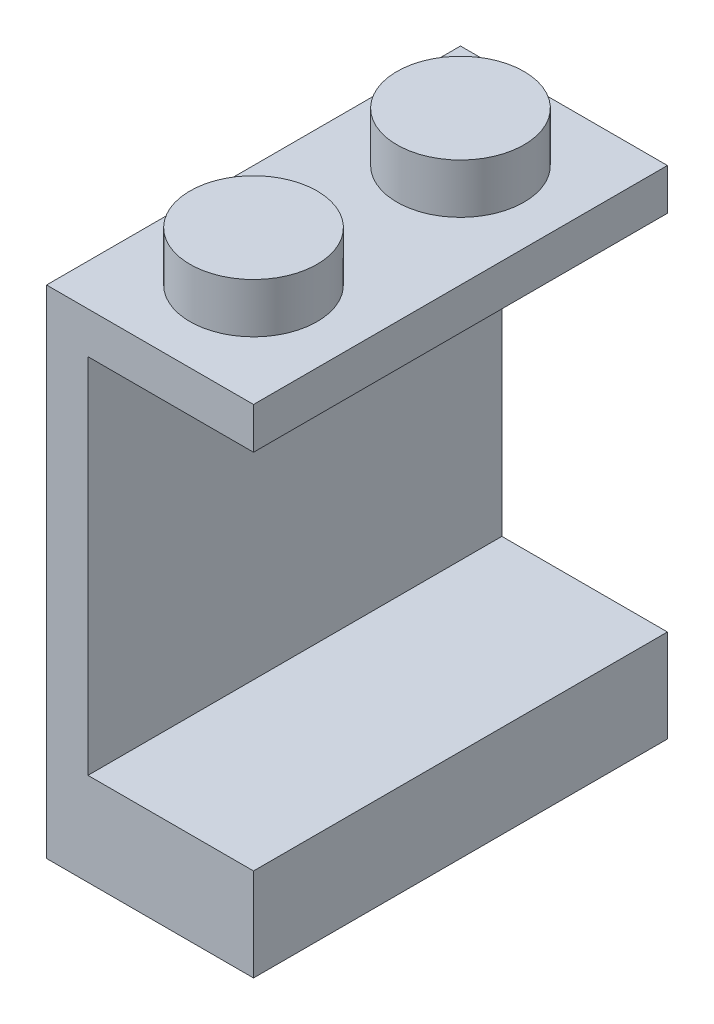
ISO-10303-21;
HEADER;
FILE_DESCRIPTION(('STEP AP214'),'2;1');
FILE_NAME('part.step','',(''),(''),'','','');
FILE_SCHEMA(('AUTOMOTIVE_DESIGN { 1 0 10303 214 1 1 1 1 }'));
ENDSEC;
DATA;
#1=APPLICATION_CONTEXT('core data for automotive mechanical design processes');
#2=APPLICATION_PROTOCOL_DEFINITION('international standard','automotive_design',2000,#1);
#3=PRODUCT_CONTEXT('',#1,'mechanical');
#4=PRODUCT('Part','Part','',(#3));
#5=PRODUCT_RELATED_PRODUCT_CATEGORY('part','',(#4));
#6=PRODUCT_DEFINITION_FORMATION('','',#4);
#7=PRODUCT_DEFINITION_CONTEXT('part definition',#1,'design');
#8=PRODUCT_DEFINITION('design','',#6,#7);
#9=PRODUCT_DEFINITION_SHAPE('','',#8);
#10=(LENGTH_UNIT() NAMED_UNIT(*) SI_UNIT(.MILLI.,.METRE.));
#11=(NAMED_UNIT(*) PLANE_ANGLE_UNIT() SI_UNIT($,.RADIAN.));
#12=(NAMED_UNIT(*) SI_UNIT($,.STERADIAN.) SOLID_ANGLE_UNIT());
#13=UNCERTAINTY_MEASURE_WITH_UNIT(LENGTH_MEASURE(1.E-05),#10,'distance_accuracy_value','');
#14=(GEOMETRIC_REPRESENTATION_CONTEXT(3) GLOBAL_UNCERTAINTY_ASSIGNED_CONTEXT((#13)) GLOBAL_UNIT_ASSIGNED_CONTEXT((#10,
#11,#12)) REPRESENTATION_CONTEXT('',''));
#15=CARTESIAN_POINT('',(0.,0.,0.));
#16=DIRECTION('',(0.,0.,1.));
#17=DIRECTION('',(1.,0.,0.));
#18=AXIS2_PLACEMENT_3D('',#15,#16,#17);
#19=CARTESIAN_POINT('',(3.96875,19.05,7.9375));
#20=DIRECTION('',(-1.,0.,0.));
#21=DIRECTION('',(0.,0.,1.));
#22=AXIS2_PLACEMENT_3D('',#19,#20,#21);
#23=PLANE('',#22);
#24=DIRECTION('',(0.,-1.,0.));
#25=VECTOR('',#24,1.);
#26=CARTESIAN_POINT('',(3.96875,19.05,-7.9375));
#27=LINE('',#26,#25);
#28=CARTESIAN_POINT('',(3.96875,3.556,-7.9375));
#29=VERTEX_POINT('',#28);
#30=CARTESIAN_POINT('',(3.96875,0.,-7.9375));
#31=VERTEX_POINT('',#30);
#32=EDGE_CURVE('E148',#29,#31,#27,.T.);
#33=ORIENTED_EDGE('',*,*,#32,.F.);
#34=DIRECTION('',(0.,0.,1.));
#35=VECTOR('',#34,1.);
#36=CARTESIAN_POINT('',(3.96875,3.556,-7.9375));
#37=LINE('',#36,#35);
#38=CARTESIAN_POINT('',(3.96875,3.556,7.93749999999999));
#39=VERTEX_POINT('',#38);
#40=EDGE_CURVE('E134',#29,#39,#37,.T.);
#41=ORIENTED_EDGE('',*,*,#40,.T.);
#42=DIRECTION('',(0.,-1.,0.));
#43=VECTOR('',#42,1.);
#44=CARTESIAN_POINT('',(3.96875,19.05,7.9375));
#45=LINE('',#44,#43);
#46=CARTESIAN_POINT('',(3.96875,0.,7.9375));
#47=VERTEX_POINT('',#46);
#48=EDGE_CURVE('E146',#39,#47,#45,.T.);
#49=ORIENTED_EDGE('',*,*,#48,.T.);
#50=DIRECTION('',(0.,0.,-1.));
#51=VECTOR('',#50,1.);
#52=CARTESIAN_POINT('',(3.96875,0.,7.9375));
#53=LINE('',#52,#51);
#54=EDGE_CURVE('E508',#47,#31,#53,.T.);
#55=ORIENTED_EDGE('',*,*,#54,.T.);
#56=EDGE_LOOP('',(#33,#41,#49,#55));
#57=FACE_BOUND('',#56,.T.);
#58=ADVANCED_FACE('F42',(#57),#23,.F.);
#59=CARTESIAN_POINT('',(-3.96875,19.05,7.9375));
#60=DIRECTION('',(0.,-1.,0.));
#61=DIRECTION('',(0.,0.,-1.));
#62=AXIS2_PLACEMENT_3D('',#59,#60,#61);
#63=PLANE('',#62);
#64=CARTESIAN_POINT('',(0.,19.05,3.96875));
#65=DIRECTION('',(0.,-1.,0.));
#66=DIRECTION('',(0.,0.,-1.));
#67=AXIS2_PLACEMENT_3D('',#64,#65,#66);
#68=CIRCLE('',#67,2.4384);
#69=CARTESIAN_POINT('',(0.,19.05,1.53035));
#70=VERTEX_POINT('',#69);
#71=EDGE_CURVE('E165',#70,#70,#68,.F.);
#72=ORIENTED_EDGE('',*,*,#71,.F.);
#73=EDGE_LOOP('',(#72));
#74=FACE_BOUND('',#73,.T.);
#75=DIRECTION('',(0.,0.,1.));
#76=VECTOR('',#75,1.);
#77=CARTESIAN_POINT('',(-3.96875,19.05,-7.9375));
#78=LINE('',#77,#76);
#79=CARTESIAN_POINT('',(-3.96875,19.05,-7.9375));
#80=VERTEX_POINT('',#79);
#81=CARTESIAN_POINT('',(-3.96875,19.05,7.9375));
#82=VERTEX_POINT('',#81);
#83=EDGE_CURVE('E513',#80,#82,#78,.T.);
#84=ORIENTED_EDGE('',*,*,#83,.T.);
#85=DIRECTION('',(-1.,0.,0.));
#86=VECTOR('',#85,1.);
#87=CARTESIAN_POINT('',(3.96875,19.05,7.9375));
#88=LINE('',#87,#86);
#89=CARTESIAN_POINT('',(3.96875,19.05,7.9375));
#90=VERTEX_POINT('',#89);
#91=EDGE_CURVE('E515',#90,#82,#88,.T.);
#92=ORIENTED_EDGE('',*,*,#91,.F.);
#93=DIRECTION('',(0.,0.,-1.));
#94=VECTOR('',#93,1.);
#95=CARTESIAN_POINT('',(3.96875,19.05,7.9375));
#96=LINE('',#95,#94);
#97=CARTESIAN_POINT('',(3.96875,19.05,-7.9375));
#98=VERTEX_POINT('',#97);
#99=EDGE_CURVE('E518',#90,#98,#96,.T.);
#100=ORIENTED_EDGE('',*,*,#99,.T.);
#101=DIRECTION('',(1.,0.,0.));
#102=VECTOR('',#101,1.);
#103=CARTESIAN_POINT('',(-3.96875,19.05,-7.9375));
#104=LINE('',#103,#102);
#105=EDGE_CURVE('E520',#80,#98,#104,.T.);
#106=ORIENTED_EDGE('',*,*,#105,.F.);
#107=EDGE_LOOP('',(#84,#92,#100,#106));
#108=FACE_BOUND('',#107,.T.);
#109=CARTESIAN_POINT('',(0.,19.05,-3.96875));
#110=DIRECTION('',(0.,-1.,0.));
#111=DIRECTION('',(0.,0.,-1.));
#112=AXIS2_PLACEMENT_3D('',#109,#110,#111);
#113=CIRCLE('',#112,2.4384);
#114=CARTESIAN_POINT('',(0.,19.05,-6.40715));
#115=VERTEX_POINT('',#114);
#116=EDGE_CURVE('E50',#115,#115,#113,.F.);
#117=ORIENTED_EDGE('',*,*,#116,.F.);
#118=EDGE_LOOP('',(#117));
#119=FACE_BOUND('',#118,.T.);
#120=ADVANCED_FACE('F172',(#74,#108,#119),#63,.F.);
#121=CARTESIAN_POINT('',(-3.96875,19.05,-7.9375));
#122=DIRECTION('',(1.,0.,0.));
#123=DIRECTION('',(0.,0.,-1.));
#124=AXIS2_PLACEMENT_3D('',#121,#122,#123);
#125=PLANE('',#124);
#126=DIRECTION('',(0.,0.,1.));
#127=VECTOR('',#126,1.);
#128=CARTESIAN_POINT('',(-3.96875,0.,-7.9375));
#129=LINE('',#128,#127);
#130=CARTESIAN_POINT('',(-3.96875,0.,-7.9375));
#131=VERTEX_POINT('',#130);
#132=CARTESIAN_POINT('',(-3.96875,0.,7.9375));
#133=VERTEX_POINT('',#132);
#134=EDGE_CURVE('E504',#131,#133,#129,.T.);
#135=ORIENTED_EDGE('',*,*,#134,.T.);
#136=DIRECTION('',(0.,-1.,0.));
#137=VECTOR('',#136,1.);
#138=CARTESIAN_POINT('',(-3.96875,19.05,7.9375));
#139=LINE('',#138,#137);
#140=EDGE_CURVE('E159',#82,#133,#139,.T.);
#141=ORIENTED_EDGE('',*,*,#140,.F.);
#142=ORIENTED_EDGE('',*,*,#83,.F.);
#143=DIRECTION('',(0.,-1.,0.));
#144=VECTOR('',#143,1.);
#145=CARTESIAN_POINT('',(-3.96875,19.05,-7.9375));
#146=LINE('',#145,#144);
#147=EDGE_CURVE('E522',#80,#131,#146,.T.);
#148=ORIENTED_EDGE('',*,*,#147,.T.);
#149=EDGE_LOOP('',(#135,#141,#142,#148));
#150=FACE_BOUND('',#149,.T.);
#151=ADVANCED_FACE('F44',(#150),#125,.F.);
#152=CARTESIAN_POINT('',(3.96875,19.05,7.9375));
#153=DIRECTION('',(0.,0.,1.));
#154=DIRECTION('',(1.,0.,0.));
#155=AXIS2_PLACEMENT_3D('',#152,#153,#154);
#156=PLANE('',#155);
#157=DIRECTION('',(1.,0.,0.));
#158=VECTOR('',#157,1.);
#159=CARTESIAN_POINT('',(-2.38125,3.556,7.93749999999999));
#160=LINE('',#159,#158);
#161=CARTESIAN_POINT('',(-2.38125,3.556,7.93749999999999));
#162=VERTEX_POINT('',#161);
#163=EDGE_CURVE('E130',#162,#39,#160,.T.);
#164=ORIENTED_EDGE('',*,*,#163,.F.);
#165=DIRECTION('',(0.,1.,0.));
#166=VECTOR('',#165,1.);
#167=CARTESIAN_POINT('',(-2.38125,3.556,7.93749999999999));
#168=LINE('',#167,#166);
#169=CARTESIAN_POINT('',(-2.38125,17.4625,7.93749999999999));
#170=VERTEX_POINT('',#169);
#171=EDGE_CURVE('E141',#162,#170,#168,.T.);
#172=ORIENTED_EDGE('',*,*,#171,.T.);
#173=DIRECTION('',(-1.,0.,0.));
#174=VECTOR('',#173,1.);
#175=CARTESIAN_POINT('',(3.96875,17.4625,7.93749999999999));
#176=LINE('',#175,#174);
#177=CARTESIAN_POINT('',(3.96875,17.4625,7.93749999999999));
#178=VERTEX_POINT('',#177);
#179=EDGE_CURVE('E444',#178,#170,#176,.T.);
#180=ORIENTED_EDGE('',*,*,#179,.F.);
#181=EDGE_CURVE('E155',#90,#178,#45,.T.);
#182=ORIENTED_EDGE('',*,*,#181,.F.);
#183=ORIENTED_EDGE('',*,*,#91,.T.);
#184=ORIENTED_EDGE('',*,*,#140,.T.);
#185=DIRECTION('',(-1.,0.,0.));
#186=VECTOR('',#185,1.);
#187=CARTESIAN_POINT('',(3.96875,0.,7.9375));
#188=LINE('',#187,#186);
#189=EDGE_CURVE('E154',#47,#133,#188,.T.);
#190=ORIENTED_EDGE('',*,*,#189,.F.);
#191=ORIENTED_EDGE('',*,*,#48,.F.);
#192=EDGE_LOOP('',(#164,#172,#180,#182,#183,#184,#190,#191));
#193=FACE_BOUND('',#192,.T.);
#194=ADVANCED_FACE('F152',(#193),#156,.T.);
#195=ORIENTED_EDGE('',*,*,#181,.T.);
#196=DIRECTION('',(0.,0.,1.));
#197=VECTOR('',#196,1.);
#198=CARTESIAN_POINT('',(3.96875,17.4625,-7.9375));
#199=LINE('',#198,#197);
#200=CARTESIAN_POINT('',(3.96875,17.4625,-7.9375));
#201=VERTEX_POINT('',#200);
#202=EDGE_CURVE('E446',#201,#178,#199,.T.);
#203=ORIENTED_EDGE('',*,*,#202,.F.);
#204=EDGE_CURVE('E156',#98,#201,#27,.T.);
#205=ORIENTED_EDGE('',*,*,#204,.F.);
#206=ORIENTED_EDGE('',*,*,#99,.F.);
#207=EDGE_LOOP('',(#195,#203,#205,#206));
#208=FACE_BOUND('',#207,.T.);
#209=ADVANCED_FACE('F182',(#208),#23,.F.);
#210=CARTESIAN_POINT('',(-3.96875,19.05,-7.9375));
#211=DIRECTION('',(0.,0.,-1.));
#212=DIRECTION('',(-1.,0.,0.));
#213=AXIS2_PLACEMENT_3D('',#210,#211,#212);
#214=PLANE('',#213);
#215=DIRECTION('',(1.,0.,0.));
#216=VECTOR('',#215,1.);
#217=CARTESIAN_POINT('',(-2.38125,3.556,-7.9375));
#218=LINE('',#217,#216);
#219=CARTESIAN_POINT('',(-2.38125,3.556,-7.9375));
#220=VERTEX_POINT('',#219);
#221=EDGE_CURVE('E447',#220,#29,#218,.T.);
#222=ORIENTED_EDGE('',*,*,#221,.T.);
#223=ORIENTED_EDGE('',*,*,#32,.T.);
#224=DIRECTION('',(1.,0.,0.));
#225=VECTOR('',#224,1.);
#226=CARTESIAN_POINT('',(-3.96875,0.,-7.9375));
#227=LINE('',#226,#225);
#228=EDGE_CURVE('E510',#131,#31,#227,.T.);
#229=ORIENTED_EDGE('',*,*,#228,.F.);
#230=ORIENTED_EDGE('',*,*,#147,.F.);
#231=ORIENTED_EDGE('',*,*,#105,.T.);
#232=ORIENTED_EDGE('',*,*,#204,.T.);
#233=DIRECTION('',(-1.,0.,0.));
#234=VECTOR('',#233,1.);
#235=CARTESIAN_POINT('',(3.96875,17.4625,-7.9375));
#236=LINE('',#235,#234);
#237=CARTESIAN_POINT('',(-2.38125,17.4625,-7.9375));
#238=VERTEX_POINT('',#237);
#239=EDGE_CURVE('E454',#201,#238,#236,.T.);
#240=ORIENTED_EDGE('',*,*,#239,.T.);
#241=DIRECTION('',(0.,1.,0.));
#242=VECTOR('',#241,1.);
#243=CARTESIAN_POINT('',(-2.38125,3.556,-7.9375));
#244=LINE('',#243,#242);
#245=EDGE_CURVE('E452',#220,#238,#244,.T.);
#246=ORIENTED_EDGE('',*,*,#245,.F.);
#247=EDGE_LOOP('',(#222,#223,#229,#230,#231,#232,#240,#246));
#248=FACE_BOUND('',#247,.T.);
#249=ADVANCED_FACE('F189',(#248),#214,.T.);
#250=CARTESIAN_POINT('',(-3.96875,0.,7.9375));
#251=DIRECTION('',(0.,-1.,0.));
#252=DIRECTION('',(0.,0.,-1.));
#253=AXIS2_PLACEMENT_3D('',#250,#251,#252);
#254=PLANE('',#253);
#255=DIRECTION('',(-1.,0.,0.));
#256=VECTOR('',#255,1.);
#257=CARTESIAN_POINT('',(2.38125,0.,6.35));
#258=LINE('',#257,#256);
#259=CARTESIAN_POINT('',(2.38125,0.,6.35));
#260=VERTEX_POINT('',#259);
#261=CARTESIAN_POINT('',(-2.38125,0.,6.35));
#262=VERTEX_POINT('',#261);
#263=EDGE_CURVE('E65',#260,#262,#258,.T.);
#264=ORIENTED_EDGE('',*,*,#263,.F.);
#265=DIRECTION('',(0.,0.,1.));
#266=VECTOR('',#265,1.);
#267=CARTESIAN_POINT('',(2.38125,0.,-6.35));
#268=LINE('',#267,#266);
#269=CARTESIAN_POINT('',(2.38125,0.,-6.35));
#270=VERTEX_POINT('',#269);
#271=EDGE_CURVE('E475',#270,#260,#268,.T.);
#272=ORIENTED_EDGE('',*,*,#271,.F.);
#273=DIRECTION('',(1.,0.,0.));
#274=VECTOR('',#273,1.);
#275=CARTESIAN_POINT('',(-2.38125,0.,-6.35));
#276=LINE('',#275,#274);
#277=CARTESIAN_POINT('',(-2.38125,0.,-6.35));
#278=VERTEX_POINT('',#277);
#279=EDGE_CURVE('E472',#278,#270,#276,.T.);
#280=ORIENTED_EDGE('',*,*,#279,.F.);
#281=DIRECTION('',(0.,0.,-1.));
#282=VECTOR('',#281,1.);
#283=CARTESIAN_POINT('',(-2.38125,0.,6.35));
#284=LINE('',#283,#282);
#285=EDGE_CURVE('E469',#262,#278,#284,.T.);
#286=ORIENTED_EDGE('',*,*,#285,.F.);
#287=EDGE_LOOP('',(#264,#272,#280,#286));
#288=FACE_BOUND('',#287,.T.);
#289=ORIENTED_EDGE('',*,*,#134,.F.);
#290=ORIENTED_EDGE('',*,*,#228,.T.);
#291=ORIENTED_EDGE('',*,*,#54,.F.);
#292=ORIENTED_EDGE('',*,*,#189,.T.);
#293=EDGE_LOOP('',(#289,#290,#291,#292));
#294=FACE_BOUND('',#293,.T.);
#295=ADVANCED_FACE('F187',(#288,#294),#254,.T.);
#296=CARTESIAN_POINT('',(0.,20.955,3.96875));
#297=DIRECTION('',(0.,-1.,0.));
#298=DIRECTION('',(0.,0.,-1.));
#299=AXIS2_PLACEMENT_3D('',#296,#297,#298);
#300=CYLINDRICAL_SURFACE('',#299,2.4384);
#301=CARTESIAN_POINT('',(0.,20.955,3.96875));
#302=DIRECTION('',(0.,1.,0.));
#303=DIRECTION('',(0.,0.,1.));
#304=AXIS2_PLACEMENT_3D('',#301,#302,#303);
#305=CIRCLE('',#304,2.4384);
#306=CARTESIAN_POINT('',(0.,20.955,1.53035));
#307=VERTEX_POINT('',#306);
#308=EDGE_CURVE('E501',#307,#307,#305,.T.);
#309=CARTESIAN_POINT('',(0.,20.955,1.53035));
#310=CARTESIAN_POINT('',(0.,20.93515625,1.53035));
#311=CARTESIAN_POINT('',(0.,20.9153125,1.53035));
#312=CARTESIAN_POINT('',(0.,20.875625,1.53035));
#313=CARTESIAN_POINT('',(0.,20.85578125,1.53035));
#314=CARTESIAN_POINT('',(0.,20.81609375,1.53035));
#315=CARTESIAN_POINT('',(0.,20.79625,1.53035));
#316=CARTESIAN_POINT('',(0.,20.7565625,1.53035));
#317=CARTESIAN_POINT('',(0.,20.73671875,1.53035));
#318=CARTESIAN_POINT('',(0.,20.69703125,1.53035));
#319=CARTESIAN_POINT('',(0.,20.6771875,1.53035));
#320=CARTESIAN_POINT('',(0.,20.6375,1.53035));
#321=CARTESIAN_POINT('',(0.,20.61765625,1.53035));
#322=CARTESIAN_POINT('',(0.,20.57796875,1.53035));
#323=CARTESIAN_POINT('',(0.,20.558125,1.53035));
#324=CARTESIAN_POINT('',(0.,20.5184375,1.53035));
#325=CARTESIAN_POINT('',(0.,20.49859375,1.53035));
#326=CARTESIAN_POINT('',(0.,20.45890625,1.53035));
#327=CARTESIAN_POINT('',(0.,20.4390625,1.53035));
#328=CARTESIAN_POINT('',(0.,20.399375,1.53035));
#329=CARTESIAN_POINT('',(0.,20.37953125,1.53035));
#330=CARTESIAN_POINT('',(0.,20.33984375,1.53035));
#331=CARTESIAN_POINT('',(0.,20.32,1.53035));
#332=CARTESIAN_POINT('',(0.,20.2803125,1.53035));
#333=CARTESIAN_POINT('',(0.,20.26046875,1.53035));
#334=CARTESIAN_POINT('',(0.,20.22078125,1.53035));
#335=CARTESIAN_POINT('',(0.,20.2009375,1.53035));
#336=CARTESIAN_POINT('',(0.,20.16125,1.53035));
#337=CARTESIAN_POINT('',(0.,20.14140625,1.53035));
#338=CARTESIAN_POINT('',(0.,20.10171875,1.53035));
#339=CARTESIAN_POINT('',(0.,20.081875,1.53035));
#340=CARTESIAN_POINT('',(0.,20.0421875,1.53035));
#341=CARTESIAN_POINT('',(0.,20.02234375,1.53035));
#342=CARTESIAN_POINT('',(0.,19.98265625,1.53035));
#343=CARTESIAN_POINT('',(0.,19.9628125,1.53035));
#344=CARTESIAN_POINT('',(0.,19.923125,1.53035));
#345=CARTESIAN_POINT('',(0.,19.90328125,1.53035));
#346=CARTESIAN_POINT('',(0.,19.86359375,1.53035));
#347=CARTESIAN_POINT('',(0.,19.84375,1.53035));
#348=CARTESIAN_POINT('',(0.,19.8040625,1.53035));
#349=CARTESIAN_POINT('',(0.,19.78421875,1.53035));
#350=CARTESIAN_POINT('',(0.,19.74453125,1.53035));
#351=CARTESIAN_POINT('',(0.,19.7246875,1.53035));
#352=CARTESIAN_POINT('',(0.,19.685,1.53035));
#353=CARTESIAN_POINT('',(0.,19.66515625,1.53035));
#354=CARTESIAN_POINT('',(0.,19.62546875,1.53035));
#355=CARTESIAN_POINT('',(0.,19.605625,1.53035));
#356=CARTESIAN_POINT('',(0.,19.5659375,1.53035));
#357=CARTESIAN_POINT('',(0.,19.54609375,1.53035));
#358=CARTESIAN_POINT('',(0.,19.50640625,1.53035));
#359=CARTESIAN_POINT('',(0.,19.4865625,1.53035));
#360=CARTESIAN_POINT('',(0.,19.446875,1.53035));
#361=CARTESIAN_POINT('',(0.,19.42703125,1.53035));
#362=CARTESIAN_POINT('',(0.,19.38734375,1.53035));
#363=CARTESIAN_POINT('',(0.,19.3675,1.53035));
#364=CARTESIAN_POINT('',(0.,19.3278125,1.53035));
#365=CARTESIAN_POINT('',(0.,19.30796875,1.53035));
#366=CARTESIAN_POINT('',(0.,19.26828125,1.53035));
#367=CARTESIAN_POINT('',(0.,19.2484375,1.53035));
#368=CARTESIAN_POINT('',(0.,19.20875,1.53035));
#369=CARTESIAN_POINT('',(0.,19.18890625,1.53035));
#370=CARTESIAN_POINT('',(0.,19.14921875,1.53035));
#371=CARTESIAN_POINT('',(0.,19.129375,1.53035));
#372=CARTESIAN_POINT('',(0.,19.0896875,1.53035));
#373=CARTESIAN_POINT('',(0.,19.06984375,1.53035));
#374=CARTESIAN_POINT('',(0.,19.05,1.53035));
#375=B_SPLINE_CURVE_WITH_KNOTS('',3,(#309,#310,#311,#312,#313,#314,#315,#316,#317,#318,#319,
#320,#321,#322,#323,#324,#325,#326,#327,#328,#329,#330,#331,#332,#333,#334,#335,#336,#337,#338,
#339,#340,#341,#342,#343,#344,#345,#346,#347,#348,#349,#350,#351,#352,#353,#354,#355,#356,#357,
#358,#359,#360,#361,#362,#363,#364,#365,#366,#367,#368,#369,#370,#371,#372,#373,#374),
.UNSPECIFIED.,.F.,.F.,(4,2,2,2,2,2,2,2,2,2,2,2,2,2,2,2,2,2,2,2,2,2,2,2,2,2,2,2,2,2,2,2,4),(0.,
0.059531249999998,0.119062499999999,0.178593749999997,0.238124999999999,0.297656249999997,
0.357187499999998,0.416718749999996,0.476249999999998,0.535781249999999,0.595312499999997,
0.654843749999998,0.714374999999996,0.773906249999998,0.833437499999996,0.892968749999997,
0.952499999999998,1.01203125,1.0715625,1.13109375,1.190625,1.25015625,1.3096875,
1.36921874999999,1.42875,1.48828125,1.5478125,1.60734375,1.66687499999999,1.72640625,
1.78593749999999,1.84546875,1.905),.UNSPECIFIED.);
#376=EDGE_CURVE('BSEAM214',#307,#70,#375,.T.);
#377=ORIENTED_EDGE('',*,*,#308,.F.);
#378=ORIENTED_EDGE('',*,*,#71,.T.);
#379=ORIENTED_EDGE('',*,*,#376,.T.);
#380=ORIENTED_EDGE('',*,*,#376,.F.);
#381=EDGE_LOOP('',(#377,#379,#378,#380));
#382=FACE_BOUND('',#381,.T.);
#383=ADVANCED_FACE('F214',(#382),#300,.T.);
#384=CARTESIAN_POINT('',(0.,20.955,3.96875));
#385=DIRECTION('',(0.,1.,0.));
#386=DIRECTION('',(0.,0.,1.));
#387=AXIS2_PLACEMENT_3D('',#384,#385,#386);
#388=PLANE('',#387);
#389=ORIENTED_EDGE('',*,*,#308,.T.);
#390=EDGE_LOOP('',(#389));
#391=FACE_BOUND('',#390,.T.);
#392=ADVANCED_FACE('F221',(#391),#388,.T.);
#393=CARTESIAN_POINT('',(0.,20.955,-3.96875));
#394=DIRECTION('',(0.,-1.,0.));
#395=DIRECTION('',(0.,0.,-1.));
#396=AXIS2_PLACEMENT_3D('',#393,#394,#395);
#397=CYLINDRICAL_SURFACE('',#396,2.4384);
#398=CARTESIAN_POINT('',(0.,20.955,-3.96875));
#399=DIRECTION('',(0.,1.,0.));
#400=DIRECTION('',(0.,0.,1.));
#401=AXIS2_PLACEMENT_3D('',#398,#399,#400);
#402=CIRCLE('',#401,2.4384);
#403=CARTESIAN_POINT('',(0.,20.955,-6.40715));
#404=VERTEX_POINT('',#403);
#405=EDGE_CURVE('E493',#404,#404,#402,.T.);
#406=CARTESIAN_POINT('',(0.,20.955,-6.40715));
#407=CARTESIAN_POINT('',(0.,20.93515625,-6.40715));
#408=CARTESIAN_POINT('',(0.,20.9153125,-6.40715));
#409=CARTESIAN_POINT('',(0.,20.875625,-6.40715));
#410=CARTESIAN_POINT('',(0.,20.85578125,-6.40715));
#411=CARTESIAN_POINT('',(0.,20.81609375,-6.40715));
#412=CARTESIAN_POINT('',(0.,20.79625,-6.40715));
#413=CARTESIAN_POINT('',(0.,20.7565625,-6.40715));
#414=CARTESIAN_POINT('',(0.,20.73671875,-6.40715));
#415=CARTESIAN_POINT('',(0.,20.69703125,-6.40715));
#416=CARTESIAN_POINT('',(0.,20.6771875,-6.40715));
#417=CARTESIAN_POINT('',(0.,20.6375,-6.40715));
#418=CARTESIAN_POINT('',(0.,20.61765625,-6.40715));
#419=CARTESIAN_POINT('',(0.,20.57796875,-6.40715));
#420=CARTESIAN_POINT('',(0.,20.558125,-6.40715));
#421=CARTESIAN_POINT('',(0.,20.5184375,-6.40715));
#422=CARTESIAN_POINT('',(0.,20.49859375,-6.40715));
#423=CARTESIAN_POINT('',(0.,20.45890625,-6.40715));
#424=CARTESIAN_POINT('',(0.,20.4390625,-6.40715));
#425=CARTESIAN_POINT('',(0.,20.399375,-6.40715));
#426=CARTESIAN_POINT('',(0.,20.37953125,-6.40715));
#427=CARTESIAN_POINT('',(0.,20.33984375,-6.40715));
#428=CARTESIAN_POINT('',(0.,20.32,-6.40715));
#429=CARTESIAN_POINT('',(0.,20.2803125,-6.40715));
#430=CARTESIAN_POINT('',(0.,20.26046875,-6.40715));
#431=CARTESIAN_POINT('',(0.,20.22078125,-6.40715));
#432=CARTESIAN_POINT('',(0.,20.2009375,-6.40715));
#433=CARTESIAN_POINT('',(0.,20.16125,-6.40715));
#434=CARTESIAN_POINT('',(0.,20.14140625,-6.40715));
#435=CARTESIAN_POINT('',(0.,20.10171875,-6.40715));
#436=CARTESIAN_POINT('',(0.,20.081875,-6.40715));
#437=CARTESIAN_POINT('',(0.,20.0421875,-6.40715));
#438=CARTESIAN_POINT('',(0.,20.02234375,-6.40715));
#439=CARTESIAN_POINT('',(0.,19.98265625,-6.40715));
#440=CARTESIAN_POINT('',(0.,19.9628125,-6.40715));
#441=CARTESIAN_POINT('',(0.,19.923125,-6.40715));
#442=CARTESIAN_POINT('',(0.,19.90328125,-6.40715));
#443=CARTESIAN_POINT('',(0.,19.86359375,-6.40715));
#444=CARTESIAN_POINT('',(0.,19.84375,-6.40715));
#445=CARTESIAN_POINT('',(0.,19.8040625,-6.40715));
#446=CARTESIAN_POINT('',(0.,19.78421875,-6.40715));
#447=CARTESIAN_POINT('',(0.,19.74453125,-6.40715));
#448=CARTESIAN_POINT('',(0.,19.7246875,-6.40715));
#449=CARTESIAN_POINT('',(0.,19.685,-6.40715));
#450=CARTESIAN_POINT('',(0.,19.66515625,-6.40715));
#451=CARTESIAN_POINT('',(0.,19.62546875,-6.40715));
#452=CARTESIAN_POINT('',(0.,19.605625,-6.40715));
#453=CARTESIAN_POINT('',(0.,19.5659375,-6.40715));
#454=CARTESIAN_POINT('',(0.,19.54609375,-6.40715));
#455=CARTESIAN_POINT('',(0.,19.50640625,-6.40715));
#456=CARTESIAN_POINT('',(0.,19.4865625,-6.40715));
#457=CARTESIAN_POINT('',(0.,19.446875,-6.40715));
#458=CARTESIAN_POINT('',(0.,19.42703125,-6.40715));
#459=CARTESIAN_POINT('',(0.,19.38734375,-6.40715));
#460=CARTESIAN_POINT('',(0.,19.3675,-6.40715));
#461=CARTESIAN_POINT('',(0.,19.3278125,-6.40715));
#462=CARTESIAN_POINT('',(0.,19.30796875,-6.40715));
#463=CARTESIAN_POINT('',(0.,19.26828125,-6.40715));
#464=CARTESIAN_POINT('',(0.,19.2484375,-6.40715));
#465=CARTESIAN_POINT('',(0.,19.20875,-6.40715));
#466=CARTESIAN_POINT('',(0.,19.18890625,-6.40715));
#467=CARTESIAN_POINT('',(0.,19.14921875,-6.40715));
#468=CARTESIAN_POINT('',(0.,19.129375,-6.40715));
#469=CARTESIAN_POINT('',(0.,19.0896875,-6.40715));
#470=CARTESIAN_POINT('',(0.,19.06984375,-6.40715));
#471=CARTESIAN_POINT('',(0.,19.05,-6.40715));
#472=B_SPLINE_CURVE_WITH_KNOTS('',3,(#406,#407,#408,#409,#410,#411,#412,#413,#414,#415,#416,
#417,#418,#419,#420,#421,#422,#423,#424,#425,#426,#427,#428,#429,#430,#431,#432,#433,#434,#435,
#436,#437,#438,#439,#440,#441,#442,#443,#444,#445,#446,#447,#448,#449,#450,#451,#452,#453,#454,
#455,#456,#457,#458,#459,#460,#461,#462,#463,#464,#465,#466,#467,#468,#469,#470,#471),
.UNSPECIFIED.,.F.,.F.,(4,2,2,2,2,2,2,2,2,2,2,2,2,2,2,2,2,2,2,2,2,2,2,2,2,2,2,2,2,2,2,2,4),(0.,
0.059531249999998,0.119062499999999,0.178593749999997,0.238124999999999,0.297656249999997,
0.357187499999998,0.416718749999996,0.476249999999998,0.535781249999999,0.595312499999997,
0.654843749999998,0.714374999999996,0.773906249999998,0.833437499999996,0.892968749999997,
0.952499999999998,1.01203125,1.0715625,1.13109375,1.190625,1.25015625,1.3096875,
1.36921874999999,1.42875,1.48828125,1.5478125,1.60734375,1.66687499999999,1.72640625,
1.78593749999999,1.84546875,1.905),.UNSPECIFIED.);
#473=EDGE_CURVE('BSEAM170',#404,#115,#472,.T.);
#474=ORIENTED_EDGE('',*,*,#405,.F.);
#475=ORIENTED_EDGE('',*,*,#116,.T.);
#476=ORIENTED_EDGE('',*,*,#473,.T.);
#477=ORIENTED_EDGE('',*,*,#473,.F.);
#478=EDGE_LOOP('',(#474,#476,#475,#477));
#479=FACE_BOUND('',#478,.T.);
#480=ADVANCED_FACE('F170',(#479),#397,.T.);
#481=CARTESIAN_POINT('',(0.,20.955,-3.96875));
#482=DIRECTION('',(0.,1.,0.));
#483=DIRECTION('',(0.,0.,1.));
#484=AXIS2_PLACEMENT_3D('',#481,#482,#483);
#485=PLANE('',#484);
#486=ORIENTED_EDGE('',*,*,#405,.T.);
#487=EDGE_LOOP('',(#486));
#488=FACE_BOUND('',#487,.T.);
#489=ADVANCED_FACE('F231',(#488),#485,.T.);
#490=CARTESIAN_POINT('',(2.38125,1.5875,6.35));
#491=DIRECTION('',(0.,0.,1.));
#492=DIRECTION('',(1.,0.,0.));
#493=AXIS2_PLACEMENT_3D('',#490,#491,#492);
#494=PLANE('',#493);
#495=ORIENTED_EDGE('',*,*,#263,.T.);
#496=DIRECTION('',(0.,-1.,0.));
#497=VECTOR('',#496,1.);
#498=CARTESIAN_POINT('',(-2.38125,1.5875,6.35));
#499=LINE('',#498,#497);
#500=CARTESIAN_POINT('',(-2.38125,1.5875,6.35));
#501=VERTEX_POINT('',#500);
#502=EDGE_CURVE('E490',#501,#262,#499,.T.);
#503=ORIENTED_EDGE('',*,*,#502,.F.);
#504=DIRECTION('',(-1.,0.,0.));
#505=VECTOR('',#504,1.);
#506=CARTESIAN_POINT('',(2.38125,1.5875,6.35));
#507=LINE('',#506,#505);
#508=CARTESIAN_POINT('',(2.38125,1.5875,6.35));
#509=VERTEX_POINT('',#508);
#510=EDGE_CURVE('E478',#509,#501,#507,.T.);
#511=ORIENTED_EDGE('',*,*,#510,.F.);
#512=DIRECTION('',(0.,-1.,0.));
#513=VECTOR('',#512,1.);
#514=CARTESIAN_POINT('',(2.38125,1.5875,6.35));
#515=LINE('',#514,#513);
#516=EDGE_CURVE('E491',#509,#260,#515,.T.);
#517=ORIENTED_EDGE('',*,*,#516,.T.);
#518=EDGE_LOOP('',(#495,#503,#511,#517));
#519=FACE_BOUND('',#518,.T.);
#520=ADVANCED_FACE('F240',(#519),#494,.F.);
#521=CARTESIAN_POINT('',(2.38125,1.5875,-6.35));
#522=DIRECTION('',(1.,0.,0.));
#523=DIRECTION('',(0.,0.,-1.));
#524=AXIS2_PLACEMENT_3D('',#521,#522,#523);
#525=PLANE('',#524);
#526=ORIENTED_EDGE('',*,*,#271,.T.);
#527=ORIENTED_EDGE('',*,*,#516,.F.);
#528=DIRECTION('',(0.,0.,1.));
#529=VECTOR('',#528,1.);
#530=CARTESIAN_POINT('',(2.38125,1.5875,-6.35));
#531=LINE('',#530,#529);
#532=CARTESIAN_POINT('',(2.38125,1.5875,-6.35));
#533=VERTEX_POINT('',#532);
#534=EDGE_CURVE('E487',#533,#509,#531,.T.);
#535=ORIENTED_EDGE('',*,*,#534,.F.);
#536=DIRECTION('',(0.,-1.,0.));
#537=VECTOR('',#536,1.);
#538=CARTESIAN_POINT('',(2.38125,1.5875,-6.35));
#539=LINE('',#538,#537);
#540=EDGE_CURVE('E494',#533,#270,#539,.T.);
#541=ORIENTED_EDGE('',*,*,#540,.T.);
#542=EDGE_LOOP('',(#526,#527,#535,#541));
#543=FACE_BOUND('',#542,.T.);
#544=ADVANCED_FACE('F251',(#543),#525,.F.);
#545=CARTESIAN_POINT('',(-2.38125,1.5875,-6.35));
#546=DIRECTION('',(0.,0.,-1.));
#547=DIRECTION('',(-1.,0.,0.));
#548=AXIS2_PLACEMENT_3D('',#545,#546,#547);
#549=PLANE('',#548);
#550=ORIENTED_EDGE('',*,*,#279,.T.);
#551=ORIENTED_EDGE('',*,*,#540,.F.);
#552=DIRECTION('',(1.,0.,0.));
#553=VECTOR('',#552,1.);
#554=CARTESIAN_POINT('',(-2.38125,1.5875,-6.35));
#555=LINE('',#554,#553);
#556=CARTESIAN_POINT('',(-2.38125,1.5875,-6.35));
#557=VERTEX_POINT('',#556);
#558=EDGE_CURVE('E484',#557,#533,#555,.T.);
#559=ORIENTED_EDGE('',*,*,#558,.F.);
#560=DIRECTION('',(0.,-1.,0.));
#561=VECTOR('',#560,1.);
#562=CARTESIAN_POINT('',(-2.38125,1.5875,-6.35));
#563=LINE('',#562,#561);
#564=EDGE_CURVE('E496',#557,#278,#563,.T.);
#565=ORIENTED_EDGE('',*,*,#564,.T.);
#566=EDGE_LOOP('',(#550,#551,#559,#565));
#567=FACE_BOUND('',#566,.T.);
#568=ADVANCED_FACE('F257',(#567),#549,.F.);
#569=CARTESIAN_POINT('',(-2.38125,1.5875,6.35));
#570=DIRECTION('',(-1.,0.,0.));
#571=DIRECTION('',(0.,0.,1.));
#572=AXIS2_PLACEMENT_3D('',#569,#570,#571);
#573=PLANE('',#572);
#574=ORIENTED_EDGE('',*,*,#285,.T.);
#575=ORIENTED_EDGE('',*,*,#564,.F.);
#576=DIRECTION('',(0.,0.,-1.));
#577=VECTOR('',#576,1.);
#578=CARTESIAN_POINT('',(-2.38125,1.5875,6.35));
#579=LINE('',#578,#577);
#580=EDGE_CURVE('E481',#501,#557,#579,.T.);
#581=ORIENTED_EDGE('',*,*,#580,.F.);
#582=ORIENTED_EDGE('',*,*,#502,.T.);
#583=EDGE_LOOP('',(#574,#575,#581,#582));
#584=FACE_BOUND('',#583,.T.);
#585=ADVANCED_FACE('F264',(#584),#573,.F.);
#586=CARTESIAN_POINT('',(-2.38125,1.5875,6.35));
#587=DIRECTION('',(0.,-1.,0.));
#588=DIRECTION('',(0.,0.,-1.));
#589=AXIS2_PLACEMENT_3D('',#586,#587,#588);
#590=PLANE('',#589);
#591=CARTESIAN_POINT('',(0.,1.5875,0.));
#592=DIRECTION('',(0.,-1.,0.));
#593=DIRECTION('',(0.,0.,-1.));
#594=AXIS2_PLACEMENT_3D('',#591,#592,#593);
#595=CIRCLE('',#594,2.032);
#596=CARTESIAN_POINT('',(0.,1.5875,-2.032));
#597=VERTEX_POINT('',#596);
#598=EDGE_CURVE('E11',#597,#597,#595,.T.);
#599=ORIENTED_EDGE('',*,*,#598,.F.);
#600=EDGE_LOOP('',(#599));
#601=FACE_BOUND('',#600,.T.);
#602=ORIENTED_EDGE('',*,*,#510,.T.);
#603=ORIENTED_EDGE('',*,*,#580,.T.);
#604=ORIENTED_EDGE('',*,*,#558,.T.);
#605=ORIENTED_EDGE('',*,*,#534,.T.);
#606=EDGE_LOOP('',(#602,#603,#604,#605));
#607=FACE_BOUND('',#606,.T.);
#608=ADVANCED_FACE('F271',(#601,#607),#590,.T.);
#609=CARTESIAN_POINT('',(0.,20.956,0.));
#610=DIRECTION('',(0.,-1.,0.));
#611=DIRECTION('',(0.,0.,-1.));
#612=AXIS2_PLACEMENT_3D('',#609,#610,#611);
#613=CYLINDRICAL_SURFACE('',#612,2.032);
#614=ORIENTED_EDGE('',*,*,#598,.T.);
#615=EDGE_LOOP('',(#614));
#616=FACE_BOUND('',#615,.T.);
#617=CARTESIAN_POINT('',(0.,0.,0.));
#618=DIRECTION('',(0.,-1.,0.));
#619=DIRECTION('',(1.,0.,0.));
#620=AXIS2_PLACEMENT_3D('',#617,#618,#619);
#621=CIRCLE('',#620,2.032);
#622=CARTESIAN_POINT('',(2.032,0.,0.));
#623=VERTEX_POINT('',#622);
#624=EDGE_CURVE('E463',#623,#623,#621,.T.);
#625=ORIENTED_EDGE('',*,*,#624,.F.);
#626=EDGE_LOOP('',(#625));
#627=FACE_BOUND('',#626,.T.);
#628=ADVANCED_FACE('F278',(#616,#627),#613,.T.);
#629=CARTESIAN_POINT('',(0.,0.,0.));
#630=DIRECTION('',(0.,-1.,0.));
#631=DIRECTION('',(0.,0.,-1.));
#632=AXIS2_PLACEMENT_3D('',#629,#630,#631);
#633=PLANE('',#632);
#634=CARTESIAN_POINT('',(0.,0.,0.));
#635=DIRECTION('',(0.,-1.,0.));
#636=DIRECTION('',(0.,0.,-1.));
#637=AXIS2_PLACEMENT_3D('',#634,#635,#636);
#638=CIRCLE('',#637,1.27);
#639=CARTESIAN_POINT('',(0.,0.,-1.27));
#640=VERTEX_POINT('',#639);
#641=EDGE_CURVE('E460',#640,#640,#638,.T.);
#642=ORIENTED_EDGE('',*,*,#641,.F.);
#643=EDGE_LOOP('',(#642));
#644=FACE_BOUND('',#643,.T.);
#645=ORIENTED_EDGE('',*,*,#624,.T.);
#646=EDGE_LOOP('',(#645));
#647=FACE_BOUND('',#646,.T.);
#648=ADVANCED_FACE('F287',(#644,#647),#633,.T.);
#649=CARTESIAN_POINT('',(0.,20.956,0.));
#650=DIRECTION('',(0.,-1.,0.));
#651=DIRECTION('',(0.,0.,-1.));
#652=AXIS2_PLACEMENT_3D('',#649,#650,#651);
#653=CYLINDRICAL_SURFACE('',#652,1.27);
#654=CARTESIAN_POINT('',(0.,1.5875,0.));
#655=DIRECTION('',(0.,-1.,0.));
#656=DIRECTION('',(0.,0.,-1.));
#657=AXIS2_PLACEMENT_3D('',#654,#655,#656);
#658=CIRCLE('',#657,1.27);
#659=CARTESIAN_POINT('',(0.,1.5875,-1.27));
#660=VERTEX_POINT('',#659);
#661=EDGE_CURVE('E149',#660,#660,#658,.F.);
#662=ORIENTED_EDGE('',*,*,#661,.T.);
#663=EDGE_LOOP('',(#662));
#664=FACE_BOUND('',#663,.T.);
#665=ORIENTED_EDGE('',*,*,#641,.T.);
#666=EDGE_LOOP('',(#665));
#667=FACE_BOUND('',#666,.T.);
#668=ADVANCED_FACE('F295',(#664,#667),#653,.F.);
#669=ORIENTED_EDGE('',*,*,#661,.F.);
#670=EDGE_LOOP('',(#669));
#671=FACE_BOUND('',#670,.T.);
#672=ADVANCED_FACE('F281',(#671),#590,.T.);
#673=CARTESIAN_POINT('',(-2.38125,3.556,-7.9375));
#674=DIRECTION('',(0.,-1.,0.));
#675=DIRECTION('',(0.,0.,-1.));
#676=AXIS2_PLACEMENT_3D('',#673,#674,#675);
#677=PLANE('',#676);
#678=ORIENTED_EDGE('',*,*,#163,.T.);
#679=ORIENTED_EDGE('',*,*,#40,.F.);
#680=ORIENTED_EDGE('',*,*,#221,.F.);
#681=DIRECTION('',(0.,0.,1.));
#682=VECTOR('',#681,1.);
#683=CARTESIAN_POINT('',(-2.38125,3.556,-7.9375));
#684=LINE('',#683,#682);
#685=EDGE_CURVE('E136',#220,#162,#684,.T.);
#686=ORIENTED_EDGE('',*,*,#685,.T.);
#687=EDGE_LOOP('',(#678,#679,#680,#686));
#688=FACE_BOUND('',#687,.T.);
#689=ADVANCED_FACE('F132',(#688),#677,.F.);
#690=CARTESIAN_POINT('',(-2.38125,3.556,-7.9375));
#691=DIRECTION('',(1.,0.,0.));
#692=DIRECTION('',(0.,0.,-1.));
#693=AXIS2_PLACEMENT_3D('',#690,#691,#692);
#694=PLANE('',#693);
#695=ORIENTED_EDGE('',*,*,#171,.F.);
#696=ORIENTED_EDGE('',*,*,#685,.F.);
#697=ORIENTED_EDGE('',*,*,#245,.T.);
#698=DIRECTION('',(0.,0.,1.));
#699=VECTOR('',#698,1.);
#700=CARTESIAN_POINT('',(-2.38125,17.4625,-7.9375));
#701=LINE('',#700,#699);
#702=EDGE_CURVE('E57',#238,#170,#701,.T.);
#703=ORIENTED_EDGE('',*,*,#702,.T.);
#704=EDGE_LOOP('',(#695,#696,#697,#703));
#705=FACE_BOUND('',#704,.T.);
#706=ADVANCED_FACE('F313',(#705),#694,.T.);
#707=CARTESIAN_POINT('',(3.96875,17.4625,-7.9375));
#708=DIRECTION('',(0.,1.,0.));
#709=DIRECTION('',(0.,0.,1.));
#710=AXIS2_PLACEMENT_3D('',#707,#708,#709);
#711=PLANE('',#710);
#712=ORIENTED_EDGE('',*,*,#179,.T.);
#713=ORIENTED_EDGE('',*,*,#702,.F.);
#714=ORIENTED_EDGE('',*,*,#239,.F.);
#715=ORIENTED_EDGE('',*,*,#202,.T.);
#716=EDGE_LOOP('',(#712,#713,#714,#715));
#717=FACE_BOUND('',#716,.T.);
#718=ADVANCED_FACE('F319',(#717),#711,.F.);
#719=CLOSED_SHELL('',(#58,#120,#151,#194,#209,#249,#295,#383,#392,#480,#489,#520,#544,#568,#585,
#608,#628,#648,#668,#672,#689,#706,#718));
#720=MANIFOLD_SOLID_BREP('B2',#719);
#721=ADVANCED_BREP_SHAPE_REPRESENTATION('',(#18,#720),#14);
#722=SHAPE_DEFINITION_REPRESENTATION(#9,#721);
ENDSEC;
END-ISO-10303-21;
